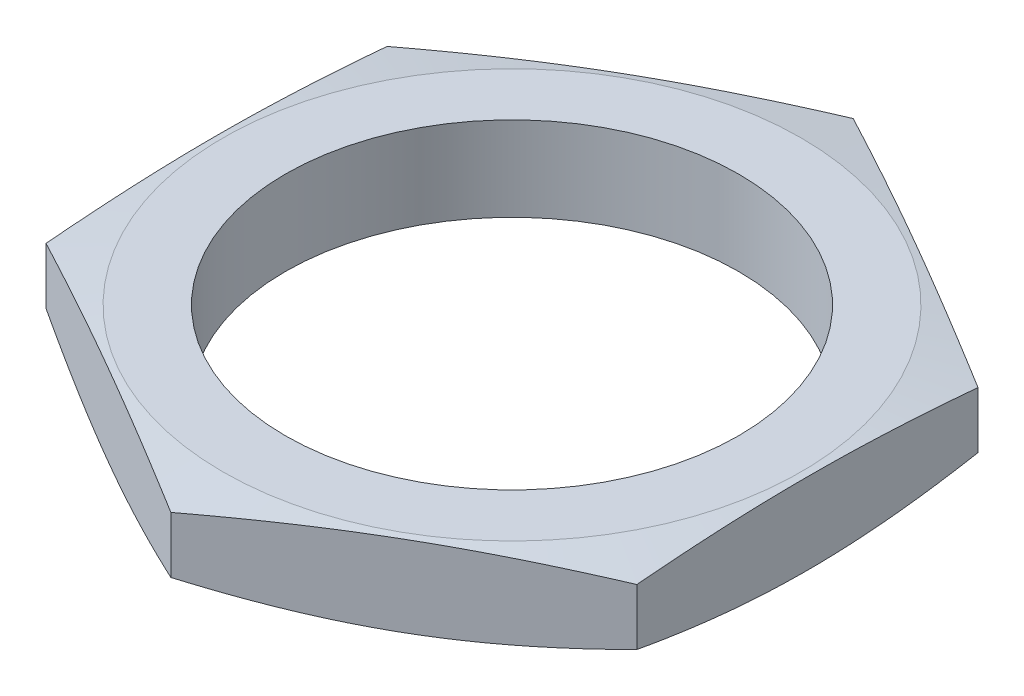
ISO-10303-21;
HEADER;
FILE_DESCRIPTION(('STEP AP214'),'2;1');
FILE_NAME('part.step','',(''),(''),'','','');
FILE_SCHEMA(('AUTOMOTIVE_DESIGN { 1 0 10303 214 1 1 1 1 }'));
ENDSEC;
DATA;
#1=APPLICATION_CONTEXT('core data for automotive mechanical design processes');
#2=APPLICATION_PROTOCOL_DEFINITION('international standard','automotive_design',2000,#1);
#3=PRODUCT_CONTEXT('',#1,'mechanical');
#4=PRODUCT('Part','Part','',(#3));
#5=PRODUCT_RELATED_PRODUCT_CATEGORY('part','',(#4));
#6=PRODUCT_DEFINITION_FORMATION('','',#4);
#7=PRODUCT_DEFINITION_CONTEXT('part definition',#1,'design');
#8=PRODUCT_DEFINITION('design','',#6,#7);
#9=PRODUCT_DEFINITION_SHAPE('','',#8);
#10=(LENGTH_UNIT() NAMED_UNIT(*) SI_UNIT(.MILLI.,.METRE.));
#11=(NAMED_UNIT(*) PLANE_ANGLE_UNIT() SI_UNIT($,.RADIAN.));
#12=(NAMED_UNIT(*) SI_UNIT($,.STERADIAN.) SOLID_ANGLE_UNIT());
#13=UNCERTAINTY_MEASURE_WITH_UNIT(LENGTH_MEASURE(1.E-05),#10,'distance_accuracy_value','');
#14=(GEOMETRIC_REPRESENTATION_CONTEXT(3) GLOBAL_UNCERTAINTY_ASSIGNED_CONTEXT((#13)) GLOBAL_UNIT_ASSIGNED_CONTEXT((#10,
#11,#12)) REPRESENTATION_CONTEXT('',''));
#15=CARTESIAN_POINT('',(0.,0.,0.));
#16=DIRECTION('',(0.,0.,1.));
#17=DIRECTION('',(1.,0.,0.));
#18=AXIS2_PLACEMENT_3D('',#15,#16,#17);
#19=CARTESIAN_POINT('',(-9.45000000000001,2.7,5.45596004384196));
#20=DIRECTION('',(0.5,0.,-0.866025403784438));
#21=DIRECTION('',(-0.866025403784438,0.,-0.5));
#22=AXIS2_PLACEMENT_3D('',#19,#20,#21);
#23=PLANE('',#22);
#24=CARTESIAN_POINT('',(0.000199999999990697,0.604931471975667,10.9120355577378));
#25=CARTESIAN_POINT('',(-0.39116177203468,0.522661719788945,10.686082733303));
#26=CARTESIAN_POINT('',(-0.783814062769791,0.447823224999012,10.4593848275492));
#27=CARTESIAN_POINT('',(-1.57167163938697,0.316156574237137,10.0045150436062));
#28=CARTESIAN_POINT('',(-1.96687867758842,0.259342510673266,9.77634215371492));
#29=CARTESIAN_POINT('',(-2.75545998319045,0.167447427205576,9.32105452464769));
#30=CARTESIAN_POINT('',(-3.14881624230688,0.132165975484557,9.09395018255939));
#31=CARTESIAN_POINT('',(-3.9364486012515,0.0848436423257385,8.63921042810025));
#32=CARTESIAN_POINT('',(-4.33072430062576,0.0727940468532412,8.4115752469316));
#33=CARTESIAN_POINT('',(-5.11927569937426,0.0727940468532413,7.95630488459429));
#34=CARTESIAN_POINT('',(-5.51355139874851,0.0848436423257386,7.72866970342564));
#35=CARTESIAN_POINT('',(-6.30118375769314,0.132165975484558,7.2739299489665));
#36=CARTESIAN_POINT('',(-6.69454001680957,0.167447427205577,7.0468256068782));
#37=CARTESIAN_POINT('',(-7.4831213224116,0.259342510673268,6.59153797781097));
#38=CARTESIAN_POINT('',(-7.87832836061305,0.316156574237138,6.36336508791972));
#39=CARTESIAN_POINT('',(-8.66618593723023,0.447823224999013,5.90849530397671));
#40=CARTESIAN_POINT('',(-9.05883822796534,0.522661719788945,5.68179739822287));
#41=CARTESIAN_POINT('',(-9.45020000000001,0.604931471975669,5.45584457378812));
#42=B_SPLINE_CURVE_WITH_KNOTS('',3,(#24,#25,#26,#27,#28,#29,#30,#31,#32,#33,#34,#35,#36,#37,#38,
#39,#40,#41),.UNSPECIFIED.,.F.,.F.,(4,2,2,2,2,2,2,2,4),(0.,1.37814186137049,2.75735858307721,
4.12353314845592,5.48919517578049,6.85485720310507,8.22103176848377,9.6002484901905,
10.978390351561),.UNSPECIFIED.);
#43=CARTESIAN_POINT('',(0.,0.604889443646022,10.9119200876839));
#44=VERTEX_POINT('',#43);
#45=CARTESIAN_POINT('',(-9.45000000000001,0.604889443646023,5.45596004384196));
#46=VERTEX_POINT('',#45);
#47=EDGE_CURVE('E72',#44,#46,#42,.T.);
#48=ORIENTED_EDGE('',*,*,#47,.F.);
#49=DIRECTION('',(0.,-1.,0.));
#50=VECTOR('',#49,1.);
#51=CARTESIAN_POINT('',(0.,2.7,10.9119200876839));
#52=LINE('',#51,#50);
#53=CARTESIAN_POINT('',(0.,2.40695864875995,10.9119200876839));
#54=VERTEX_POINT('',#53);
#55=EDGE_CURVE('E13',#54,#44,#52,.T.);
#56=ORIENTED_EDGE('',*,*,#55,.F.);
#57=CARTESIAN_POINT('',(-9.45020000000001,2.40693828795082,5.45584457378812));
#58=CARTESIAN_POINT('',(-9.05700645067961,2.44698389491592,5.68285497533188));
#59=CARTESIAN_POINT('',(-8.66350118570861,2.48328856603693,5.91004534599042));
#60=CARTESIAN_POINT('',(-7.87588798524061,2.54701292685943,6.36477403929793));
#61=CARTESIAN_POINT('',(-7.48177995842246,2.57443110051928,6.59231241467117));
#62=CARTESIAN_POINT('',(-6.6940015897203,2.61891474047134,7.04713646790313));
#63=CARTESIAN_POINT('',(-6.30033225212905,2.63600331486629,7.27442156593314));
#64=CARTESIAN_POINT('',(-5.51277526286629,2.65891279083289,7.72911780568617));
#65=CARTESIAN_POINT('',(-5.11888763143315,2.66473460385831,7.95652893572456));
#66=CARTESIAN_POINT('',(-4.33111236856687,2.66473460385831,8.41135119580133));
#67=CARTESIAN_POINT('',(-3.93722473713373,2.65891279083289,8.63876232583972));
#68=CARTESIAN_POINT('',(-3.14966774787097,2.63600331486629,9.09345856559275));
#69=CARTESIAN_POINT('',(-2.75599841027972,2.61891474047134,9.32074366362276));
#70=CARTESIAN_POINT('',(-1.96822004157755,2.57443110051928,9.77556771685471));
#71=CARTESIAN_POINT('',(-1.57411201475941,2.54701292685943,10.003106092228));
#72=CARTESIAN_POINT('',(-0.786498814291401,2.48328856603693,10.4578347855355));
#73=CARTESIAN_POINT('',(-0.392993549320405,2.44698389491593,10.685025156194));
#74=CARTESIAN_POINT('',(0.000199999999992196,2.40693828795082,10.9120355577378));
#75=B_SPLINE_CURVE_WITH_KNOTS('',3,(#57,#58,#59,#60,#61,#62,#63,#64,#65,#66,#67,#68,#69,#70,#71,
#72,#73,#74),.UNSPECIFIED.,.F.,.F.,(4,2,2,2,2,2,2,2,4),(0.,1.36737987109473,2.73499289535162,
4.09953503170519,5.46396677528283,6.82839851886047,8.19294065521404,9.56055367947094,
10.9279335505657),.UNSPECIFIED.);
#76=CARTESIAN_POINT('',(-9.45000000000001,2.40695864875995,5.45596004384196));
#77=VERTEX_POINT('',#76);
#78=EDGE_CURVE('E133',#77,#54,#75,.T.);
#79=ORIENTED_EDGE('',*,*,#78,.F.);
#80=DIRECTION('',(0.,-1.,0.));
#81=VECTOR('',#80,1.);
#82=CARTESIAN_POINT('',(-9.45000000000001,2.7,5.45596004384196));
#83=LINE('',#82,#81);
#84=EDGE_CURVE('E129',#77,#46,#83,.T.);
#85=ORIENTED_EDGE('',*,*,#84,.T.);
#86=EDGE_LOOP('',(#48,#56,#79,#85));
#87=FACE_BOUND('',#86,.T.);
#88=ADVANCED_FACE('F56',(#87),#23,.F.);
#89=CARTESIAN_POINT('',(0.,2.7,10.9119200876839));
#90=DIRECTION('',(-0.5,0.,-0.866025403784438));
#91=DIRECTION('',(-0.866025403784439,0.,0.5));
#92=AXIS2_PLACEMENT_3D('',#89,#90,#91);
#93=PLANE('',#92);
#94=CARTESIAN_POINT('',(9.4502,0.604931471975664,5.45584457378812));
#95=CARTESIAN_POINT('',(9.05883822796532,0.522661719788941,5.68179739822286));
#96=CARTESIAN_POINT('',(8.66618593723021,0.447823224999009,5.9084953039767));
#97=CARTESIAN_POINT('',(7.87832836061304,0.316156574237134,6.36336508791972));
#98=CARTESIAN_POINT('',(7.48312132241158,0.259342510673263,6.59153797781096));
#99=CARTESIAN_POINT('',(6.69454001680956,0.167447427205573,7.0468256068782));
#100=CARTESIAN_POINT('',(6.30118375769312,0.132165975484554,7.2739299489665));
#101=CARTESIAN_POINT('',(5.5135513987485,0.0848436423257355,7.72866970342564));
#102=CARTESIAN_POINT('',(5.11927569937425,0.0727940468532381,7.95630488459429));
#103=CARTESIAN_POINT('',(4.33072430062574,0.0727940468532384,8.4115752469316));
#104=CARTESIAN_POINT('',(3.93644860125149,0.0848436423257361,8.63921042810025));
#105=CARTESIAN_POINT('',(3.14881624230686,0.132165975484555,9.09395018255939));
#106=CARTESIAN_POINT('',(2.75545998319043,0.167447427205575,9.32105452464769));
#107=CARTESIAN_POINT('',(1.9668786775884,0.259342510673265,9.77634215371492));
#108=CARTESIAN_POINT('',(1.57167163938694,0.316156574237136,10.0045150436062));
#109=CARTESIAN_POINT('',(0.783814062769771,0.447823224999012,10.4593848275492));
#110=CARTESIAN_POINT('',(0.391161772034659,0.522661719788944,10.686082733303));
#111=CARTESIAN_POINT('',(-0.000200000000013004,0.604931471975668,10.9120355577378));
#112=B_SPLINE_CURVE_WITH_KNOTS('',3,(#94,#95,#96,#97,#98,#99,#100,#101,#102,#103,#104,#105,#106,
#107,#108,#109,#110,#111),.UNSPECIFIED.,.F.,.F.,(4,2,2,2,2,2,2,2,4),(0.,1.37814186137049,
2.75735858307722,4.12353314845592,5.4891951757805,6.85485720310507,8.22103176848378,
9.60024849019051,10.978390351561),.UNSPECIFIED.);
#113=CARTESIAN_POINT('',(9.45,0.604889443646019,5.45596004384196));
#114=VERTEX_POINT('',#113);
#115=EDGE_CURVE('E154',#114,#44,#112,.T.);
#116=ORIENTED_EDGE('',*,*,#115,.F.);
#117=DIRECTION('',(0.,-1.,0.));
#118=VECTOR('',#117,1.);
#119=CARTESIAN_POINT('',(9.45,2.7,5.45596004384196));
#120=LINE('',#119,#118);
#121=CARTESIAN_POINT('',(9.45,2.40695864875995,5.45596004384196));
#122=VERTEX_POINT('',#121);
#123=EDGE_CURVE('E65',#122,#114,#120,.T.);
#124=ORIENTED_EDGE('',*,*,#123,.F.);
#125=CARTESIAN_POINT('',(-0.000200000000008827,2.40693828795082,10.9120355577378));
#126=CARTESIAN_POINT('',(0.392993549320388,2.44698389491593,10.685025156194));
#127=CARTESIAN_POINT('',(0.786498814291384,2.48328856603693,10.4578347855355));
#128=CARTESIAN_POINT('',(1.57411201475939,2.54701292685943,10.003106092228));
#129=CARTESIAN_POINT('',(1.96822004157754,2.57443110051928,9.77556771685471));
#130=CARTESIAN_POINT('',(2.7559984102797,2.61891474047134,9.32074366362276));
#131=CARTESIAN_POINT('',(3.14966774787095,2.63600331486629,9.09345856559274));
#132=CARTESIAN_POINT('',(3.93722473713371,2.65891279083289,8.63876232583972));
#133=CARTESIAN_POINT('',(4.33111236856685,2.66473460385831,8.41135119580133));
#134=CARTESIAN_POINT('',(5.11888763143313,2.66473460385831,7.95652893572455));
#135=CARTESIAN_POINT('',(5.51277526286627,2.65891279083289,7.72911780568617));
#136=CARTESIAN_POINT('',(6.30033225212903,2.63600331486629,7.27442156593314));
#137=CARTESIAN_POINT('',(6.69400158972028,2.61891474047134,7.04713646790313));
#138=CARTESIAN_POINT('',(7.48177995842245,2.57443110051928,6.59231241467117));
#139=CARTESIAN_POINT('',(7.87588798524059,2.54701292685943,6.36477403929792));
#140=CARTESIAN_POINT('',(8.6635011857086,2.48328856603693,5.91004534599041));
#141=CARTESIAN_POINT('',(9.0570064506796,2.44698389491593,5.68285497533187));
#142=CARTESIAN_POINT('',(9.4502,2.40693828795082,5.45584457378812));
#143=B_SPLINE_CURVE_WITH_KNOTS('',3,(#125,#126,#127,#128,#129,#130,#131,#132,#133,#134,#135,
#136,#137,#138,#139,#140,#141,#142),.UNSPECIFIED.,.F.,.F.,(4,2,2,2,2,2,2,2,4),(0.,
1.36737987109473,2.73499289535163,4.0995350317052,5.46396677528284,6.82839851886048,
8.19294065521405,9.56055367947095,10.9279335505657),.UNSPECIFIED.);
#144=EDGE_CURVE('E152',#54,#122,#143,.T.);
#145=ORIENTED_EDGE('',*,*,#144,.F.);
#146=ORIENTED_EDGE('',*,*,#55,.T.);
#147=EDGE_LOOP('',(#116,#124,#145,#146));
#148=FACE_BOUND('',#147,.T.);
#149=ADVANCED_FACE('F151',(#148),#93,.F.);
#150=CARTESIAN_POINT('',(9.45,2.7,5.45596004384196));
#151=DIRECTION('',(-1.,0.,0.));
#152=DIRECTION('',(0.,0.,1.));
#153=AXIS2_PLACEMENT_3D('',#150,#151,#152);
#154=PLANE('',#153);
#155=CARTESIAN_POINT('',(9.45,2.97410530472487,-14.6355302802244));
#156=CARTESIAN_POINT('',(9.45,2.84273899888362,-14.2057875394033));
#157=CARTESIAN_POINT('',(9.45,2.71286459415715,-13.7755804875353));
#158=CARTESIAN_POINT('',(9.45,2.45692483788982,-12.9140008018397));
#159=CARTESIAN_POINT('',(9.45,2.33085977466454,-12.4826280824654));
#160=CARTESIAN_POINT('',(9.45,2.08316849705575,-11.6177923414623));
#161=CARTESIAN_POINT('',(9.45,1.96155039737826,-11.1843269875938));
#162=CARTESIAN_POINT('',(9.45,1.72412658335078,-10.3158095062493));
#163=CARTESIAN_POINT('',(9.45,1.60832076904984,-9.88075740619783));
#164=CARTESIAN_POINT('',(9.45,1.38536680289763,-9.01422597611041));
#165=CARTESIAN_POINT('',(9.45,1.27812854071489,-8.58276994333086));
#166=CARTESIAN_POINT('',(9.45,1.07249799768333,-7.71773330772136));
#167=CARTESIAN_POINT('',(9.45,0.974105862939353,-7.28415266992557));
#168=CARTESIAN_POINT('',(9.45,0.788396883771,-6.41472836816547));
#169=CARTESIAN_POINT('',(9.45,0.701077061366148,-5.9788853456539));
#170=CARTESIAN_POINT('',(9.45,0.540118786802214,-5.1046612244478));
#171=CARTESIAN_POINT('',(9.45,0.46647990208226,-4.66628020645113));
#172=CARTESIAN_POINT('',(9.45,0.343079585775342,-3.83586077898856));
#173=CARTESIAN_POINT('',(9.45,0.291574428306943,-3.44408392666394));
#174=CARTESIAN_POINT('',(9.45,0.203753129241725,-2.65881699375703));
#175=CARTESIAN_POINT('',(9.45,0.167436550986399,-2.26532696275581));
#176=CARTESIAN_POINT('',(9.45,0.111738167776795,-1.47743944071811));
#177=CARTESIAN_POINT('',(9.45,0.0923431613541255,-1.08304289820165));
#178=CARTESIAN_POINT('',(9.45,0.0714733781084328,-0.293771185644266));
#179=CARTESIAN_POINT('',(9.45,0.0699984326285679,0.101103979857066));
#180=CARTESIAN_POINT('',(9.45,0.0850916039162126,0.892630025609207));
#181=CARTESIAN_POINT('',(9.45,0.101756888604957,1.28927902244289));
#182=CARTESIAN_POINT('',(9.45,0.152376780796574,2.08146295071781));
#183=CARTESIAN_POINT('',(9.45,0.186331818415629,2.47699785419765));
#184=CARTESIAN_POINT('',(9.45,0.269903604125542,3.26674875881191));
#185=CARTESIAN_POINT('',(9.45,0.319534563375612,3.66096323388566));
#186=CARTESIAN_POINT('',(9.45,0.432387873036417,4.44741687601889));
#187=CARTESIAN_POINT('',(9.45,0.495610237090378,4.83965604109511));
#188=CARTESIAN_POINT('',(9.45,0.642253278984616,5.6716130089701));
#189=CARTESIAN_POINT('',(9.45,0.727217639319904,6.11105650092583));
#190=CARTESIAN_POINT('',(9.45,0.908928455431038,6.98751773637385));
#191=CARTESIAN_POINT('',(9.45,1.00567603270239,7.42453524482208));
#192=CARTESIAN_POINT('',(9.45,1.20863396416639,8.29652025986796));
#193=CARTESIAN_POINT('',(9.45,1.31484775163203,8.73148696194813));
#194=CARTESIAN_POINT('',(9.45,1.53480248556611,9.5994883142388));
#195=CARTESIAN_POINT('',(9.45,1.64854319991575,10.0325230235898));
#196=CARTESIAN_POINT('',(9.45,1.88223600356987,10.8976350898706));
#197=CARTESIAN_POINT('',(9.45,2.00219754949779,11.3297098822546));
#198=CARTESIAN_POINT('',(9.45,2.24698978814599,12.1924762846291));
#199=CARTESIAN_POINT('',(9.45,2.37182050727674,12.6231678871034));
#200=CARTESIAN_POINT('',(9.45,2.62540261020202,13.483292612344));
#201=CARTESIAN_POINT('',(9.44999999999999,2.75415314943107,13.9127259846542));
#202=CARTESIAN_POINT('',(9.44999999999999,3.01488802544347,14.7706110216581));
#203=CARTESIAN_POINT('',(9.44999999999999,3.14687238363407,15.1990626798325));
#204=CARTESIAN_POINT('',(9.44999999999999,3.54356011788111,16.4727815389565));
#205=CARTESIAN_POINT('',(9.44999999999999,3.81210869874012,17.3168507816092));
#206=CARTESIAN_POINT('',(9.44999999999999,4.35643299191715,19.0026995660648));
#207=CARTESIAN_POINT('',(9.44999999999999,4.63220913579783,19.844478967812));
#208=CARTESIAN_POINT('',(9.44999999999999,5.18778463280556,21.5226530086144));
#209=CARTESIAN_POINT('',(9.44999999999999,5.46756132303307,22.3590551597935));
#210=CARTESIAN_POINT('',(9.44999999999999,5.89011020785137,23.6126415948099));
#211=CARTESIAN_POINT('',(9.44999999999999,6.03143399826951,24.0303153413994));
#212=CARTESIAN_POINT('',(9.44999999999999,6.31492944369406,24.8653739965778));
#213=CARTESIAN_POINT('',(9.44999999999999,6.45710109680772,25.2827589058091));
#214=CARTESIAN_POINT('',(9.44999999999999,6.59963824477244,25.7000190240632));
#215=B_SPLINE_CURVE_WITH_KNOTS('',3,(#155,#156,#157,#158,#159,#160,#161,#162,#163,#164,#165,
#166,#167,#168,#169,#170,#171,#172,#173,#174,#175,#176,#177,#178,#179,#180,#181,#182,#183,#184,
#185,#186,#187,#188,#189,#190,#191,#192,#193,#194,#195,#196,#197,#198,#199,#200,#201,#202,#203,
#204,#205,#206,#207,#208,#209,#210,#211,#212,#213,#214),.UNSPECIFIED.,.F.,.F.,(4,2,2,2,2,2,2,2,
2,2,2,2,2,2,2,2,2,2,2,2,2,2,2,2,2,2,2,2,2,4),(0.,1.34812757228137,2.69635692528648,
4.04693480505602,5.39748945164913,6.73116586579557,8.06486430323055,9.39820326828349,
10.7315000689418,11.91668869478,13.1018432451284,14.2860723609563,15.4702903312586,
16.6608829061153,17.8515051007217,19.0432097785598,20.2349156526519,21.5774562995724,
22.920124825973,24.2632823182845,25.6063984089778,26.9516197792077,28.2968484469543,
29.6417892944997,30.9867390477012,33.6439658324962,36.3013516452171,38.9472011891594,
40.2700058951502,41.5928076492283),.UNSPECIFIED.);
#216=CARTESIAN_POINT('',(9.45,0.604889443646019,-5.45596004384195));
#217=VERTEX_POINT('',#216);
#218=EDGE_CURVE('E146',#217,#114,#215,.T.);
#219=ORIENTED_EDGE('',*,*,#218,.F.);
#220=DIRECTION('',(0.,-1.,0.));
#221=VECTOR('',#220,1.);
#222=CARTESIAN_POINT('',(9.45,2.7,-5.45596004384195));
#223=LINE('',#222,#221);
#224=CARTESIAN_POINT('',(9.45,2.40695864875995,-5.45596004384195));
#225=VERTEX_POINT('',#224);
#226=EDGE_CURVE('E131',#225,#217,#223,.T.);
#227=ORIENTED_EDGE('',*,*,#226,.F.);
#228=CARTESIAN_POINT('',(9.45,1.2760904618284,-14.5212505500911));
#229=CARTESIAN_POINT('',(9.45,1.33966212911283,-14.0909859449258));
#230=CARTESIAN_POINT('',(9.45,1.40244208633068,-13.6606022946632));
#231=CARTESIAN_POINT('',(9.45,1.52599936762933,-12.799539691931));
#232=CARTESIAN_POINT('',(9.45,1.58677665400461,-12.3688607340571));
#233=CARTESIAN_POINT('',(9.45,1.70593124879381,-11.5069907818868));
#234=CARTESIAN_POINT('',(9.45,1.76430756832391,-11.0757996503999));
#235=CARTESIAN_POINT('',(9.45,1.87807442710082,-10.2130239055743));
#236=CARTESIAN_POINT('',(9.45,1.93346497737279,-9.78143929369451));
#237=CARTESIAN_POINT('',(9.45,2.04038257380804,-8.91930200233707));
#238=CARTESIAN_POINT('',(9.45,2.09192229448546,-8.48875090226268));
#239=CARTESIAN_POINT('',(9.45,2.19049774130021,-7.6271342648896));
#240=CARTESIAN_POINT('',(9.45,2.23753351004776,-7.19606873249683));
#241=CARTESIAN_POINT('',(9.45,2.32607526399607,-6.33338524782512));
#242=CARTESIAN_POINT('',(9.45,2.36758150142994,-5.90176732165138));
#243=CARTESIAN_POINT('',(9.45,2.44388430308482,-5.03793247759784));
#244=CARTESIAN_POINT('',(9.45,2.47868086849562,-4.60571555982428));
#245=CARTESIAN_POINT('',(9.45,2.54044090930669,-3.73864788109915));
#246=CARTESIAN_POINT('',(9.45,2.56736633346279,-3.30379437194328));
#247=CARTESIAN_POINT('',(9.45,2.61193353317795,-2.43360770246029));
#248=CARTESIAN_POINT('',(9.45,2.6295753891801,-1.99827454632211));
#249=CARTESIAN_POINT('',(9.45,2.65462769196834,-1.12739414679962));
#250=CARTESIAN_POINT('',(9.45,2.6620401537811,-0.691846962490012));
#251=CARTESIAN_POINT('',(9.45,2.66620382780998,0.179298951742638));
#252=CARTESIAN_POINT('',(9.45,2.66295505050214,0.614897681614607));
#253=CARTESIAN_POINT('',(9.45,2.64597629531734,1.48661615123712));
#254=CARTESIAN_POINT('',(9.45,2.63222878501573,1.92273554284848));
#255=CARTESIAN_POINT('',(9.45,2.59500503028295,2.79455509720586));
#256=CARTESIAN_POINT('',(9.45,2.57152870575864,3.23025525647091));
#257=CARTESIAN_POINT('',(9.45,2.51599158224873,4.10121743684655));
#258=CARTESIAN_POINT('',(9.45,2.48392847829775,4.53647930877105));
#259=CARTESIAN_POINT('',(9.45,2.41251439523482,5.40639792483968));
#260=CARTESIAN_POINT('',(9.45,2.37316340901164,5.84105466839294));
#261=CARTESIAN_POINT('',(9.45,2.28766233291463,6.71760300564913));
#262=CARTESIAN_POINT('',(9.45,2.24140247903243,7.15948379460643));
#263=CARTESIAN_POINT('',(9.45,2.14379594516157,8.04268628360169));
#264=CARTESIAN_POINT('',(9.45,2.09244918195929,8.48400797437407));
#265=CARTESIAN_POINT('',(9.45,1.9856442707588,9.36617541882537));
#266=CARTESIAN_POINT('',(9.45,1.93018589730465,9.80702114505854));
#267=CARTESIAN_POINT('',(9.45,1.81595199037597,10.6882839550535));
#268=CARTESIAN_POINT('',(9.45,1.75717643357826,11.1287010357794));
#269=CARTESIAN_POINT('',(9.45,1.63692936965101,12.0092516736042));
#270=CARTESIAN_POINT('',(9.45,1.57545734915085,12.4493851603839));
#271=CARTESIAN_POINT('',(9.45,1.45032327952098,13.3293411914948));
#272=CARTESIAN_POINT('',(9.44999999999999,1.38666122389153,13.7691637348992));
#273=CARTESIAN_POINT('',(9.44999999999999,1.19300888939043,15.0882044031908));
#274=CARTESIAN_POINT('',(9.44999999999999,1.06034765152987,15.9670301489526));
#275=CARTESIAN_POINT('',(9.44999999999999,0.790803990984669,17.7197327928015));
#276=CARTESIAN_POINT('',(9.44999999999999,0.653944753659174,18.5936132810717));
#277=CARTESIAN_POINT('',(9.44999999999999,0.376788642668146,20.340837607238));
#278=CARTESIAN_POINT('',(9.44999999999999,0.236491732231847,21.2141814392913));
#279=CARTESIAN_POINT('',(9.44999999999999,-0.0464969934602856,22.9598315811174));
#280=CARTESIAN_POINT('',(9.44999999999999,-0.189187002686657,23.8321381843945));
#281=CARTESIAN_POINT('',(9.44999999999999,-0.476470889627362,25.5764223480005));
#282=CARTESIAN_POINT('',(9.44999999999999,-0.621064733941318,26.4483999138267));
#283=CARTESIAN_POINT('',(9.44999999999999,-0.766318098327112,27.3202663497937));
#284=B_SPLINE_CURVE_WITH_KNOTS('',3,(#228,#229,#230,#231,#232,#233,#234,#235,#236,#237,#238,
#239,#240,#241,#242,#243,#244,#245,#246,#247,#248,#249,#250,#251,#252,#253,#254,#255,#256,#257,
#258,#259,#260,#261,#262,#263,#264,#265,#266,#267,#268,#269,#270,#271,#272,#273,#274,#275,#276,
#277,#278,#279,#280,#281,#282,#283),.UNSPECIFIED.,.F.,.F.,(4,2,2,2,2,2,2,2,2,2,2,2,2,2,2,2,2,2,
2,2,2,2,2,2,2,2,2,4),(0.,1.3048091683449,2.60964288911643,3.91500875596265,5.22036980232128,
6.52122558658328,7.82206906271672,9.1228531797069,10.4236370660326,11.7306090715702,
13.0375697518718,14.3442729451066,15.6509748543386,16.9598636832236,18.2687632878416,
19.5780145956307,20.8872671809464,22.2201179065602,23.552990439061,24.8859361123991,
26.2188911588716,27.5521010930692,28.8853149843941,31.5516380312455,34.2052272272705,
36.8588448195784,39.5105426451028,42.1621940117664),.UNSPECIFIED.);
#285=EDGE_CURVE('E147',#122,#225,#284,.F.);
#286=ORIENTED_EDGE('',*,*,#285,.F.);
#287=ORIENTED_EDGE('',*,*,#123,.T.);
#288=EDGE_LOOP('',(#219,#227,#286,#287));
#289=FACE_BOUND('',#288,.T.);
#290=ADVANCED_FACE('F144',(#289),#154,.F.);
#291=CARTESIAN_POINT('',(9.45,2.7,-5.45596004384195));
#292=DIRECTION('',(-0.5,0.,0.866025403784439));
#293=DIRECTION('',(0.866025403784439,0.,0.5));
#294=AXIS2_PLACEMENT_3D('',#291,#292,#293);
#295=PLANE('',#294);
#296=CARTESIAN_POINT('',(-0.000200000000006928,0.604931471975663,-10.9120355577378));
#297=CARTESIAN_POINT('',(0.391161772034665,0.52266171978894,-10.686082733303));
#298=CARTESIAN_POINT('',(0.783814062769776,0.447823224999008,-10.4593848275492));
#299=CARTESIAN_POINT('',(1.57167163938695,0.316156574237132,-10.0045150436062));
#300=CARTESIAN_POINT('',(1.96687867758841,0.259342510673261,-9.77634215371491));
#301=CARTESIAN_POINT('',(2.75545998319043,0.167447427205571,-9.32105452464768));
#302=CARTESIAN_POINT('',(3.14881624230687,0.132165975484553,-9.09395018255938));
#303=CARTESIAN_POINT('',(3.93644860125149,0.0848436423257339,-8.63921042810024));
#304=CARTESIAN_POINT('',(4.33072430062574,0.0727940468532361,-8.41157524693159));
#305=CARTESIAN_POINT('',(5.11927569937425,0.0727940468532362,-7.95630488459428));
#306=CARTESIAN_POINT('',(5.5135513987485,0.0848436423257342,-7.72866970342563));
#307=CARTESIAN_POINT('',(6.30118375769313,0.132165975484553,-7.27392994896649));
#308=CARTESIAN_POINT('',(6.69454001680956,0.167447427205572,-7.04682560687819));
#309=CARTESIAN_POINT('',(7.48312132241159,0.259342510673263,-6.59153797781096));
#310=CARTESIAN_POINT('',(7.87832836061304,0.316156574237134,-6.36336508791971));
#311=CARTESIAN_POINT('',(8.66618593723022,0.447823224999009,-5.9084953039767));
#312=CARTESIAN_POINT('',(9.05883822796533,0.522661719788941,-5.68179739822286));
#313=CARTESIAN_POINT('',(9.4502,0.604931471975664,-5.45584457378812));
#314=B_SPLINE_CURVE_WITH_KNOTS('',3,(#296,#297,#298,#299,#300,#301,#302,#303,#304,#305,#306,
#307,#308,#309,#310,#311,#312,#313),.UNSPECIFIED.,.F.,.F.,(4,2,2,2,2,2,2,2,4),(0.,
1.37814186137049,2.75735858307721,4.12353314845592,5.4891951757805,6.85485720310507,
8.22103176848378,9.6002484901905,10.978390351561),.UNSPECIFIED.);
#315=CARTESIAN_POINT('',(0.,0.604889443646018,-10.9119200876839));
#316=VERTEX_POINT('',#315);
#317=EDGE_CURVE('E125',#316,#217,#314,.T.);
#318=ORIENTED_EDGE('',*,*,#317,.F.);
#319=DIRECTION('',(0.,-1.,0.));
#320=VECTOR('',#319,1.);
#321=CARTESIAN_POINT('',(0.,2.7,-10.9119200876839));
#322=LINE('',#321,#320);
#323=CARTESIAN_POINT('',(0.,2.40695864875995,-10.9119200876839));
#324=VERTEX_POINT('',#323);
#325=EDGE_CURVE('E124',#324,#316,#322,.T.);
#326=ORIENTED_EDGE('',*,*,#325,.F.);
#327=CARTESIAN_POINT('',(9.4502,2.40693828795082,-5.45584457378812));
#328=CARTESIAN_POINT('',(9.0570064506796,2.44698389491593,-5.68285497533187));
#329=CARTESIAN_POINT('',(8.66350118570861,2.48328856603693,-5.91004534599041));
#330=CARTESIAN_POINT('',(7.8758879852406,2.54701292685943,-6.36477403929792));
#331=CARTESIAN_POINT('',(7.48177995842245,2.57443110051928,-6.59231241467117));
#332=CARTESIAN_POINT('',(6.69400158972029,2.61891474047135,-7.04713646790313));
#333=CARTESIAN_POINT('',(6.30033225212904,2.63600331486629,-7.27442156593313));
#334=CARTESIAN_POINT('',(5.51277526286628,2.65891279083289,-7.72911780568616));
#335=CARTESIAN_POINT('',(5.11888763143314,2.66473460385831,-7.95652893572455));
#336=CARTESIAN_POINT('',(4.33111236856686,2.66473460385831,-8.41135119580132));
#337=CARTESIAN_POINT('',(3.93722473713372,2.65891279083289,-8.63876232583971));
#338=CARTESIAN_POINT('',(3.14966774787096,2.63600331486629,-9.09345856559274));
#339=CARTESIAN_POINT('',(2.75599841027971,2.61891474047135,-9.32074366362274));
#340=CARTESIAN_POINT('',(1.96822004157754,2.57443110051928,-9.7755677168547));
#341=CARTESIAN_POINT('',(1.5741120147594,2.54701292685943,-10.003106092228));
#342=CARTESIAN_POINT('',(0.786498814291389,2.48328856603694,-10.4578347855355));
#343=CARTESIAN_POINT('',(0.392993549320393,2.44698389491593,-10.685025156194));
#344=CARTESIAN_POINT('',(-0.000200000000005057,2.40693828795082,-10.9120355577378));
#345=B_SPLINE_CURVE_WITH_KNOTS('',3,(#327,#328,#329,#330,#331,#332,#333,#334,#335,#336,#337,
#338,#339,#340,#341,#342,#343,#344),.UNSPECIFIED.,.F.,.F.,(4,2,2,2,2,2,2,2,4),(0.,
1.36737987109473,2.73499289535163,4.0995350317052,5.46396677528284,6.82839851886047,
8.19294065521404,9.56055367947094,10.9279335505657),.UNSPECIFIED.);
#346=EDGE_CURVE('E216',#225,#324,#345,.T.);
#347=ORIENTED_EDGE('',*,*,#346,.F.);
#348=ORIENTED_EDGE('',*,*,#226,.T.);
#349=EDGE_LOOP('',(#318,#326,#347,#348));
#350=FACE_BOUND('',#349,.T.);
#351=ADVANCED_FACE('F208',(#350),#295,.F.);
#352=CARTESIAN_POINT('',(0.,2.7,-10.9119200876839));
#353=DIRECTION('',(0.5,0.,0.866025403784439));
#354=DIRECTION('',(0.866025403784439,0.,-0.5));
#355=AXIS2_PLACEMENT_3D('',#352,#353,#354);
#356=PLANE('',#355);
#357=CARTESIAN_POINT('',(-9.45020000000001,0.604931471975667,-5.45584457378812));
#358=CARTESIAN_POINT('',(-9.05883822796534,0.522661719788944,-5.68179739822286));
#359=CARTESIAN_POINT('',(-8.66618593723022,0.447823224999012,-5.9084953039767));
#360=CARTESIAN_POINT('',(-7.87832836061305,0.316156574237137,-6.36336508791971));
#361=CARTESIAN_POINT('',(-7.4831213224116,0.259342510673266,-6.59153797781096));
#362=CARTESIAN_POINT('',(-6.69454001680957,0.167447427205575,-7.0468256068782));
#363=CARTESIAN_POINT('',(-6.30118375769314,0.132165975484556,-7.27392994896649));
#364=CARTESIAN_POINT('',(-5.51355139874851,0.0848436423257367,-7.72866970342563));
#365=CARTESIAN_POINT('',(-5.11927569937426,0.0727940468532391,-7.95630488459428));
#366=CARTESIAN_POINT('',(-4.33072430062576,0.0727940468532387,-8.41157524693159));
#367=CARTESIAN_POINT('',(-3.9364486012515,0.0848436423257359,-8.63921042810024));
#368=CARTESIAN_POINT('',(-3.14881624230688,0.132165975484554,-9.09395018255938));
#369=CARTESIAN_POINT('',(-2.75545998319045,0.167447427205573,-9.32105452464768));
#370=CARTESIAN_POINT('',(-1.96687867758842,0.259342510673262,-9.77634215371491));
#371=CARTESIAN_POINT('',(-1.57167163938696,0.316156574237133,-10.0045150436062));
#372=CARTESIAN_POINT('',(-0.783814062769791,0.447823224999008,-10.4593848275492));
#373=CARTESIAN_POINT('',(-0.39116177203468,0.52266171978894,-10.686082733303));
#374=CARTESIAN_POINT('',(0.000199999999990862,0.604931471975663,-10.9120355577378));
#375=B_SPLINE_CURVE_WITH_KNOTS('',3,(#357,#358,#359,#360,#361,#362,#363,#364,#365,#366,#367,
#368,#369,#370,#371,#372,#373,#374),.UNSPECIFIED.,.F.,.F.,(4,2,2,2,2,2,2,2,4),(0.,
1.37814186137049,2.75735858307721,4.12353314845592,5.48919517578049,6.85485720310506,
8.22103176848377,9.60024849019049,10.978390351561),.UNSPECIFIED.);
#376=CARTESIAN_POINT('',(-9.45000000000001,0.604889443645997,-5.45596004384198));
#377=VERTEX_POINT('',#376);
#378=EDGE_CURVE('E110',#377,#316,#375,.T.);
#379=ORIENTED_EDGE('',*,*,#378,.F.);
#380=DIRECTION('',(0.,-1.,0.));
#381=VECTOR('',#380,1.);
#382=CARTESIAN_POINT('',(-9.45000000000001,2.7,-5.45596004384196));
#383=LINE('',#382,#381);
#384=CARTESIAN_POINT('',(-9.45000000000001,2.40695864875995,-5.45596004384196));
#385=VERTEX_POINT('',#384);
#386=EDGE_CURVE('E122',#385,#377,#383,.T.);
#387=ORIENTED_EDGE('',*,*,#386,.F.);
#388=CARTESIAN_POINT('',(0.000199999999993132,2.40693828795082,-10.9120355577378));
#389=CARTESIAN_POINT('',(-0.392993549320404,2.44698389491593,-10.685025156194));
#390=CARTESIAN_POINT('',(-0.7864988142914,2.48328856603693,-10.4578347855355));
#391=CARTESIAN_POINT('',(-1.57411201475941,2.54701292685943,-10.003106092228));
#392=CARTESIAN_POINT('',(-1.96822004157755,2.57443110051928,-9.7755677168547));
#393=CARTESIAN_POINT('',(-2.75599841027972,2.61891474047134,-9.32074366362275));
#394=CARTESIAN_POINT('',(-3.14966774787097,2.63600331486629,-9.09345856559274));
#395=CARTESIAN_POINT('',(-3.93722473713373,2.65891279083289,-8.63876232583971));
#396=CARTESIAN_POINT('',(-4.33111236856687,2.66473460385831,-8.41135119580132));
#397=CARTESIAN_POINT('',(-5.11888763143315,2.66473460385831,-7.95652893572455));
#398=CARTESIAN_POINT('',(-5.51277526286629,2.65891279083289,-7.72911780568616));
#399=CARTESIAN_POINT('',(-6.30033225212905,2.63600331486629,-7.27442156593314));
#400=CARTESIAN_POINT('',(-6.6940015897203,2.61891474047134,-7.04713646790313));
#401=CARTESIAN_POINT('',(-7.48177995842246,2.57443110051928,-6.59231241467117));
#402=CARTESIAN_POINT('',(-7.8758879852406,2.54701292685943,-6.36477403929792));
#403=CARTESIAN_POINT('',(-8.66350118570861,2.48328856603693,-5.91004534599041));
#404=CARTESIAN_POINT('',(-9.05700645067961,2.44698389491593,-5.68285497533187));
#405=CARTESIAN_POINT('',(-9.45020000000001,2.40693828795082,-5.45584457378812));
#406=B_SPLINE_CURVE_WITH_KNOTS('',3,(#388,#389,#390,#391,#392,#393,#394,#395,#396,#397,#398,
#399,#400,#401,#402,#403,#404,#405),.UNSPECIFIED.,.F.,.F.,(4,2,2,2,2,2,2,2,4),(0.,
1.36737987109473,2.73499289535163,4.09953503170519,5.46396677528283,6.82839851886047,
8.19294065521404,9.56055367947093,10.9279335505657),.UNSPECIFIED.);
#407=EDGE_CURVE('E80',#324,#385,#406,.T.);
#408=ORIENTED_EDGE('',*,*,#407,.F.);
#409=ORIENTED_EDGE('',*,*,#325,.T.);
#410=EDGE_LOOP('',(#379,#387,#408,#409));
#411=FACE_BOUND('',#410,.T.);
#412=ADVANCED_FACE('F121',(#411),#356,.F.);
#413=CARTESIAN_POINT('',(-9.45000000000001,2.7,-5.45596004384196));
#414=DIRECTION('',(1.,0.,0.));
#415=DIRECTION('',(0.,0.,-1.));
#416=AXIS2_PLACEMENT_3D('',#413,#414,#415);
#417=PLANE('',#416);
#418=CARTESIAN_POINT('',(-9.45000000000001,2.97410530447796,-14.6355302794169));
#419=CARTESIAN_POINT('',(-9.45000000000001,2.84273899864842,-14.2057875386271));
#420=CARTESIAN_POINT('',(-9.45000000000001,2.71286459393362,-13.7755804867905));
#421=CARTESIAN_POINT('',(-9.45000000000001,2.4569248376895,-12.9140008011577));
#422=CARTESIAN_POINT('',(-9.45000000000001,2.33085977447576,-12.4826280818147));
#423=CARTESIAN_POINT('',(-9.45000000000001,2.08316849688989,-11.6177923408747));
#424=CARTESIAN_POINT('',(-9.45000000000001,1.96155039722377,-11.1843269870379));
#425=CARTESIAN_POINT('',(-9.45000000000001,1.72412658321871,-10.3158095057569));
#426=CARTESIAN_POINT('',(-9.45000000000001,1.60832076892879,-9.88075740573727));
#427=CARTESIAN_POINT('',(-9.45000000000001,1.38536680279796,-9.01422597571327));
#428=CARTESIAN_POINT('',(-9.45000000000001,1.27812854062558,-8.58276994296532));
#429=CARTESIAN_POINT('',(-9.45000000000001,1.07249799761393,-7.71773330741928));
#430=CARTESIAN_POINT('',(-9.45000000000001,0.974105862879516,-7.28415266965534));
#431=CARTESIAN_POINT('',(-9.45000000000001,0.788396883729057,-6.41472836795919));
#432=CARTESIAN_POINT('',(-9.45000000000001,0.701077061332547,-5.97888534547971));
#433=CARTESIAN_POINT('',(-9.45000000000001,0.540118786783564,-5.10466122433817));
#434=CARTESIAN_POINT('',(-9.45000000000001,0.466479902070221,-4.66628020637396));
#435=CARTESIAN_POINT('',(-9.45000000000001,0.343079585767996,-3.83586077893568));
#436=CARTESIAN_POINT('',(-9.45000000000001,0.291574428299184,-3.44408392660266));
#437=CARTESIAN_POINT('',(-9.45000000000001,0.203753129233899,-2.65881699367891));
#438=CARTESIAN_POINT('',(-9.45000000000001,0.16743655097892,-2.26532696266924));
#439=CARTESIAN_POINT('',(-9.45000000000001,0.111738167770845,-1.47743944061466));
#440=CARTESIAN_POINT('',(-9.45000000000001,0.0923431613493559,-1.08304289808977));
#441=CARTESIAN_POINT('',(-9.45000000000001,0.0714733781068466,-0.293771185515582));
#442=CARTESIAN_POINT('',(-9.45000000000001,0.0699984326289843,0.101103979994122));
#443=CARTESIAN_POINT('',(-9.45000000000001,0.0850916039213657,0.892630025763221));
#444=CARTESIAN_POINT('',(-9.45000000000001,0.101756888612861,1.28927902260549));
#445=CARTESIAN_POINT('',(-9.45000000000001,0.152376780810547,2.08146295089744));
#446=CARTESIAN_POINT('',(-9.45000000000001,0.18633181843292,2.47699785438572));
#447=CARTESIAN_POINT('',(-9.45000000000001,0.269903604149842,3.26674875901676));
#448=CARTESIAN_POINT('',(-9.45000000000001,0.319534563403604,3.66096323409885));
#449=CARTESIAN_POINT('',(-9.45000000000001,0.43238787307199,4.44741687624862));
#450=CARTESIAN_POINT('',(-9.45000000000001,0.49561023712984,4.83965604133305));
#451=CARTESIAN_POINT('',(-9.45000000000001,0.642253279030813,5.6716130092163));
#452=CARTESIAN_POINT('',(-9.45000000000001,0.727217639368657,6.1110565011721));
#453=CARTESIAN_POINT('',(-9.45000000000001,0.908928455484447,6.9875177366203));
#454=CARTESIAN_POINT('',(-9.45000000000001,1.0056760327579,7.42453524506864));
#455=CARTESIAN_POINT('',(-9.45000000000001,1.20863396422572,8.29652026011476));
#456=CARTESIAN_POINT('',(-9.45000000000001,1.31484775169308,8.73148696219507));
#457=CARTESIAN_POINT('',(-9.45000000000001,1.5348024856303,9.59948831448608));
#458=CARTESIAN_POINT('',(-9.45000000000001,1.64854319998136,10.0325230238372));
#459=CARTESIAN_POINT('',(-9.45000000000001,1.88223600363806,10.8976350901184));
#460=CARTESIAN_POINT('',(-9.45000000000001,2.00219754956713,11.3297098825025));
#461=CARTESIAN_POINT('',(-9.45000000000001,2.24698978821744,12.1924762848773));
#462=CARTESIAN_POINT('',(-9.45000000000001,2.37182050734916,12.6231678873518));
#463=CARTESIAN_POINT('',(-9.45000000000001,2.62540261027622,13.4832926125929));
#464=CARTESIAN_POINT('',(-9.45000000000001,2.75415314950608,13.9127259849032));
#465=CARTESIAN_POINT('',(-9.45000000000001,3.01488802552,14.7706110219076));
#466=CARTESIAN_POINT('',(-9.45000000000001,3.1468723837113,15.1990626800823));
#467=CARTESIAN_POINT('',(-9.45000000000001,3.54356011795937,16.4727815392041));
#468=CARTESIAN_POINT('',(-9.45000000000001,3.81210869881854,17.3168507818545));
#469=CARTESIAN_POINT('',(-9.45000000000001,4.35643299199563,19.0026995663054));
#470=CARTESIAN_POINT('',(-9.45000000000001,4.63220913587619,19.8444789680504));
#471=CARTESIAN_POINT('',(-9.45000000000001,5.18778463288366,21.5226530088486));
#472=CARTESIAN_POINT('',(-9.45000000000001,5.46756132311102,22.359055160026));
#473=CARTESIAN_POINT('',(-9.45000000000001,5.89011020792901,23.6126415950396));
#474=CARTESIAN_POINT('',(-9.45000000000001,6.03143399834703,24.0303153416283));
#475=CARTESIAN_POINT('',(-9.45000000000001,6.31492944377131,24.8653739968049));
#476=CARTESIAN_POINT('',(-9.45000000000001,6.45710109688483,25.2827589060353));
#477=CARTESIAN_POINT('',(-9.45000000000001,6.5996382448494,25.7000190242885));
#478=B_SPLINE_CURVE_WITH_KNOTS('',3,(#418,#419,#420,#421,#422,#423,#424,#425,#426,#427,#428,
#429,#430,#431,#432,#433,#434,#435,#436,#437,#438,#439,#440,#441,#442,#443,#444,#445,#446,#447,
#448,#449,#450,#451,#452,#453,#454,#455,#456,#457,#458,#459,#460,#461,#462,#463,#464,#465,#466,
#467,#468,#469,#470,#471,#472,#473,#474,#475,#476,#477),.UNSPECIFIED.,.F.,.F.,(4,2,2,2,2,2,2,2,
2,2,2,2,2,2,2,2,2,2,2,2,2,2,2,2,2,2,2,2,2,4),(0.,1.34812757218123,2.69635692508619,
4.04693480475498,5.39748945124733,6.73116586529427,8.06486430262973,9.39820326758338,
10.7315000681425,11.9166886940057,13.1018432443793,14.2860723602322,15.4702903305596,
16.6608829054423,17.8515051000748,19.0432097779391,20.2349156520574,21.5774562989796,
22.9201248253818,24.263282317695,25.6063984083899,26.9516197786211,28.2968484463691,
29.6417892939158,30.9867390471187,33.6439658319071,36.3013516446214,38.9472011885584,
40.2700058945465,41.5928076486219),.UNSPECIFIED.);
#479=EDGE_CURVE('E107',#46,#377,#478,.F.);
#480=ORIENTED_EDGE('',*,*,#479,.F.);
#481=ORIENTED_EDGE('',*,*,#84,.F.);
#482=CARTESIAN_POINT('',(-9.45000000000001,1.27609046188072,-14.5212505497371));
#483=CARTESIAN_POINT('',(-9.45000000000001,1.33966212916255,-14.0909859445863));
#484=CARTESIAN_POINT('',(-9.45000000000001,1.40244208637779,-13.6606022943383));
#485=CARTESIAN_POINT('',(-9.45000000000001,1.52599936767128,-12.7995396916352));
#486=CARTESIAN_POINT('',(-9.45000000000001,1.58677665404401,-12.3688607337759));
#487=CARTESIAN_POINT('',(-9.45000000000001,1.70593124882815,-11.5069907816347));
#488=CARTESIAN_POINT('',(-9.45000000000001,1.76430756835575,-11.0757996501624));
#489=CARTESIAN_POINT('',(-9.45000000000001,1.87807442712775,-10.213023905366));
#490=CARTESIAN_POINT('',(-9.45000000000001,1.93346497739732,-9.78143929350087));
#491=CARTESIAN_POINT('',(-9.45000000000001,2.04038257382792,-8.91930200217252));
#492=CARTESIAN_POINT('',(-9.45000000000001,2.0919222945031,-8.4887509021126));
#493=CARTESIAN_POINT('',(-9.45000000000001,2.19049774131358,-7.6271342647685));
#494=CARTESIAN_POINT('',(-9.45000000000001,2.2375335100591,-7.19606873239024));
#495=CARTESIAN_POINT('',(-9.45000000000001,2.32607526400363,-6.33338524774757));
#496=CARTESIAN_POINT('',(-9.45000000000001,2.36758150143576,-5.90176732158837));
#497=CARTESIAN_POINT('',(-9.45000000000001,2.44388430308756,-5.03793247756394));
#498=CARTESIAN_POINT('',(-9.45000000000001,2.47868086849703,-4.60571555980495));
#499=CARTESIAN_POINT('',(-9.45000000000001,2.54044090930591,-3.73864788110966));
#500=CARTESIAN_POINT('',(-9.45000000000001,2.56736633346118,-3.30379437196905));
#501=CARTESIAN_POINT('',(-9.45000000000001,2.61193353317536,-2.43360770251662));
#502=CARTESIAN_POINT('',(-9.45000000000001,2.62957538917736,-1.99827454639373));
#503=CARTESIAN_POINT('',(-9.45000000000001,2.65462769196608,-1.12739414690182));
#504=CARTESIAN_POINT('',(-9.45000000000001,2.66204015377946,-0.691846962607496));
#505=CARTESIAN_POINT('',(-9.45000000000001,2.66620382781035,0.179298951594601));
#506=CARTESIAN_POINT('',(-9.45000000000001,2.66295505050389,0.614897681451304));
#507=CARTESIAN_POINT('',(-9.45000000000001,2.64597629532254,1.48661615104328));
#508=CARTESIAN_POINT('',(-9.45000000000001,2.63222878502299,1.92273554263938));
#509=CARTESIAN_POINT('',(-9.45000000000001,2.59500503029485,2.79455509696627));
#510=CARTESIAN_POINT('',(-9.45000000000001,2.57152870577311,3.23025525621612));
#511=CARTESIAN_POINT('',(-9.45000000000001,2.5159915822687,4.10121743656138));
#512=CARTESIAN_POINT('',(-9.45000000000001,2.48392847832063,4.53647930847071));
#513=CARTESIAN_POINT('',(-9.45000000000001,2.41251439526374,5.40639792450905));
#514=CARTESIAN_POINT('',(-9.45000000000001,2.37316340904367,5.84105466804717));
#515=CARTESIAN_POINT('',(-9.45000000000001,2.28766233295153,6.71760300528842));
#516=CARTESIAN_POINT('',(-9.45000000000001,2.24140247907087,7.15948379424588));
#517=CARTESIAN_POINT('',(-9.45000000000001,2.14379594520279,8.04268628324145));
#518=CARTESIAN_POINT('',(-9.45000000000001,2.09244918200174,8.48400797401396));
#519=CARTESIAN_POINT('',(-9.45000000000001,1.9856442708035,9.36617541846554));
#520=CARTESIAN_POINT('',(-9.45000000000001,1.93018589735035,9.80702114469883));
#521=CARTESIAN_POINT('',(-9.45000000000001,1.81595199042348,10.6882839546941));
#522=CARTESIAN_POINT('',(-9.45000000000001,1.75717643362658,11.12870103542));
#523=CARTESIAN_POINT('',(-9.45000000000001,1.63692936970079,12.0092516732451));
#524=CARTESIAN_POINT('',(-9.45000000000001,1.5754573492013,12.4493851600249));
#525=CARTESIAN_POINT('',(-9.45000000000001,1.45032327957261,13.329341191136));
#526=CARTESIAN_POINT('',(-9.45000000000001,1.38666122394369,13.7691637345406));
#527=CARTESIAN_POINT('',(-9.45000000000001,1.19300888944404,15.0882044028324));
#528=CARTESIAN_POINT('',(-9.45000000000001,1.06034765158426,15.9670301485944));
#529=CARTESIAN_POINT('',(-9.45000000000001,0.790803991040346,17.7197327924439));
#530=CARTESIAN_POINT('',(-9.45000000000001,0.653944753715355,18.5936132807145));
#531=CARTESIAN_POINT('',(-9.45000000000001,0.376788642725179,20.3408376068815));
#532=CARTESIAN_POINT('',(-9.45000000000001,0.236491732289229,21.2141814389351));
#533=CARTESIAN_POINT('',(-9.45000000000001,-0.046496993402291,22.9598315807618));
#534=CARTESIAN_POINT('',(-9.45000000000001,-0.189187002628399,23.8321381840392));
#535=CARTESIAN_POINT('',(-9.45000000000001,-0.47647088956865,25.5764223476456));
#536=CARTESIAN_POINT('',(-9.45000000000001,-0.621064733882415,26.448399913472));
#537=CARTESIAN_POINT('',(-9.45000000000001,-0.76631809826804,27.3202663494392));
#538=B_SPLINE_CURVE_WITH_KNOTS('',3,(#482,#483,#484,#485,#486,#487,#488,#489,#490,#491,#492,
#493,#494,#495,#496,#497,#498,#499,#500,#501,#502,#503,#504,#505,#506,#507,#508,#509,#510,#511,
#512,#513,#514,#515,#516,#517,#518,#519,#520,#521,#522,#523,#524,#525,#526,#527,#528,#529,#530,
#531,#532,#533,#534,#535,#536,#537),.UNSPECIFIED.,.F.,.F.,(4,2,2,2,2,2,2,2,2,2,2,2,2,2,2,2,2,2,
2,2,2,2,2,2,2,2,2,4),(0.,1.30480916830055,2.60964288902773,3.91500875582954,5.22036980214375,
6.52122558636183,7.82206906245136,9.12285317939764,10.4236370656794,11.7306090711711,
13.037569751427,14.3442729446159,15.6509748538021,16.9598636826412,18.2687632872132,
19.5780145949562,20.8872671802259,22.2201179058397,23.5529904383405,24.8859361116786,
26.2188911581511,27.5521010923488,28.8853149836738,31.5516380305253,34.2052272265512,
36.85884481886,39.510542644385,42.1621940110491),.UNSPECIFIED.);
#539=EDGE_CURVE('E128',#385,#77,#538,.T.);
#540=ORIENTED_EDGE('',*,*,#539,.F.);
#541=ORIENTED_EDGE('',*,*,#386,.T.);
#542=EDGE_LOOP('',(#480,#481,#540,#541));
#543=FACE_BOUND('',#542,.T.);
#544=ADVANCED_FACE('F127',(#543),#417,.F.);
#545=CARTESIAN_POINT('',(0.,2.7,0.));
#546=DIRECTION('',(0.,-1.,0.));
#547=DIRECTION('',(0.,0.,1.));
#548=AXIS2_PLACEMENT_3D('',#545,#546,#547);
#549=CONICAL_SURFACE('',#548,9.25,1.39626340159547);
#550=CARTESIAN_POINT('',(0.,2.7,0.));
#551=DIRECTION('',(0.,1.,0.));
#552=DIRECTION('',(0.,0.,1.));
#553=AXIS2_PLACEMENT_3D('',#550,#551,#552);
#554=CIRCLE('',#553,9.25);
#555=CARTESIAN_POINT('',(0.,2.7,9.25));
#556=VERTEX_POINT('',#555);
#557=EDGE_CURVE('E156',#556,#556,#554,.T.);
#558=ORIENTED_EDGE('',*,*,#557,.F.);
#559=EDGE_LOOP('',(#558));
#560=FACE_BOUND('',#559,.T.);
#561=ORIENTED_EDGE('',*,*,#78,.T.);
#562=ORIENTED_EDGE('',*,*,#144,.T.);
#563=ORIENTED_EDGE('',*,*,#285,.T.);
#564=ORIENTED_EDGE('',*,*,#346,.T.);
#565=ORIENTED_EDGE('',*,*,#407,.T.);
#566=ORIENTED_EDGE('',*,*,#539,.T.);
#567=EDGE_LOOP('',(#561,#562,#563,#564,#565,#566));
#568=FACE_BOUND('',#567,.T.);
#569=ADVANCED_FACE('F184',(#560,#568),#549,.T.);
#570=CARTESIAN_POINT('',(0.,2.7,0.));
#571=DIRECTION('',(0.,1.,0.));
#572=DIRECTION('',(0.,0.,1.));
#573=AXIS2_PLACEMENT_3D('',#570,#571,#572);
#574=PLANE('',#573);
#575=CARTESIAN_POINT('',(0.,2.7,0.));
#576=DIRECTION('',(0.,1.,0.));
#577=DIRECTION('',(0.,0.,1.));
#578=AXIS2_PLACEMENT_3D('',#575,#576,#577);
#579=CIRCLE('',#578,7.25);
#580=CARTESIAN_POINT('',(0.,2.7,7.25));
#581=VERTEX_POINT('',#580);
#582=EDGE_CURVE('E314',#581,#581,#579,.T.);
#583=ORIENTED_EDGE('',*,*,#582,.F.);
#584=EDGE_LOOP('',(#583));
#585=FACE_BOUND('',#584,.T.);
#586=ORIENTED_EDGE('',*,*,#557,.T.);
#587=EDGE_LOOP('',(#586));
#588=FACE_BOUND('',#587,.T.);
#589=ADVANCED_FACE('F181',(#585,#588),#574,.T.);
#590=CARTESIAN_POINT('',(0.,0.,0.));
#591=DIRECTION('',(0.,1.,0.));
#592=DIRECTION('',(0.,0.,-1.));
#593=AXIS2_PLACEMENT_3D('',#590,#591,#592);
#594=CONICAL_SURFACE('',#593,9.25,1.22173047639603);
#595=CARTESIAN_POINT('',(0.,0.,0.));
#596=DIRECTION('',(0.,-1.,0.));
#597=DIRECTION('',(0.,0.,-1.));
#598=AXIS2_PLACEMENT_3D('',#595,#596,#597);
#599=CIRCLE('',#598,9.25);
#600=CARTESIAN_POINT('',(0.,0.,-9.25));
#601=VERTEX_POINT('',#600);
#602=EDGE_CURVE('E116',#601,#601,#599,.T.);
#603=ORIENTED_EDGE('',*,*,#602,.F.);
#604=EDGE_LOOP('',(#603));
#605=FACE_BOUND('',#604,.T.);
#606=ORIENTED_EDGE('',*,*,#47,.T.);
#607=ORIENTED_EDGE('',*,*,#479,.T.);
#608=ORIENTED_EDGE('',*,*,#378,.T.);
#609=ORIENTED_EDGE('',*,*,#317,.T.);
#610=ORIENTED_EDGE('',*,*,#218,.T.);
#611=ORIENTED_EDGE('',*,*,#115,.T.);
#612=EDGE_LOOP('',(#606,#607,#608,#609,#610,#611));
#613=FACE_BOUND('',#612,.T.);
#614=ADVANCED_FACE('F109',(#605,#613),#594,.T.);
#615=CARTESIAN_POINT('',(0.,0.,0.));
#616=DIRECTION('',(0.,1.,0.));
#617=DIRECTION('',(0.,0.,1.));
#618=AXIS2_PLACEMENT_3D('',#615,#616,#617);
#619=PLANE('',#618);
#620=CARTESIAN_POINT('',(0.,0.,0.));
#621=DIRECTION('',(0.,1.,0.));
#622=DIRECTION('',(0.,0.,1.));
#623=AXIS2_PLACEMENT_3D('',#620,#621,#622);
#624=CIRCLE('',#623,7.25);
#625=CARTESIAN_POINT('',(0.,0.,7.25));
#626=VERTEX_POINT('',#625);
#627=EDGE_CURVE('E60',#626,#626,#624,.T.);
#628=ORIENTED_EDGE('',*,*,#627,.T.);
#629=EDGE_LOOP('',(#628));
#630=FACE_BOUND('',#629,.T.);
#631=ORIENTED_EDGE('',*,*,#602,.T.);
#632=EDGE_LOOP('',(#631));
#633=FACE_BOUND('',#632,.T.);
#634=ADVANCED_FACE('F180',(#630,#633),#619,.F.);
#635=CARTESIAN_POINT('',(0.,2.7,0.));
#636=DIRECTION('',(0.,1.,0.));
#637=DIRECTION('',(0.,0.,1.));
#638=AXIS2_PLACEMENT_3D('',#635,#636,#637);
#639=CYLINDRICAL_SURFACE('',#638,7.25);
#640=ORIENTED_EDGE('',*,*,#582,.T.);
#641=EDGE_LOOP('',(#640));
#642=FACE_BOUND('',#641,.T.);
#643=ORIENTED_EDGE('',*,*,#627,.F.);
#644=EDGE_LOOP('',(#643));
#645=FACE_BOUND('',#644,.T.);
#646=ADVANCED_FACE('F183',(#642,#645),#639,.F.);
#647=CLOSED_SHELL('',(#88,#149,#290,#351,#412,#544,#569,#589,#614,#634,#646));
#648=MANIFOLD_SOLID_BREP('B2',#647);
#649=ADVANCED_BREP_SHAPE_REPRESENTATION('',(#18,#648),#14);
#650=SHAPE_DEFINITION_REPRESENTATION(#9,#649);
ENDSEC;
END-ISO-10303-21;
